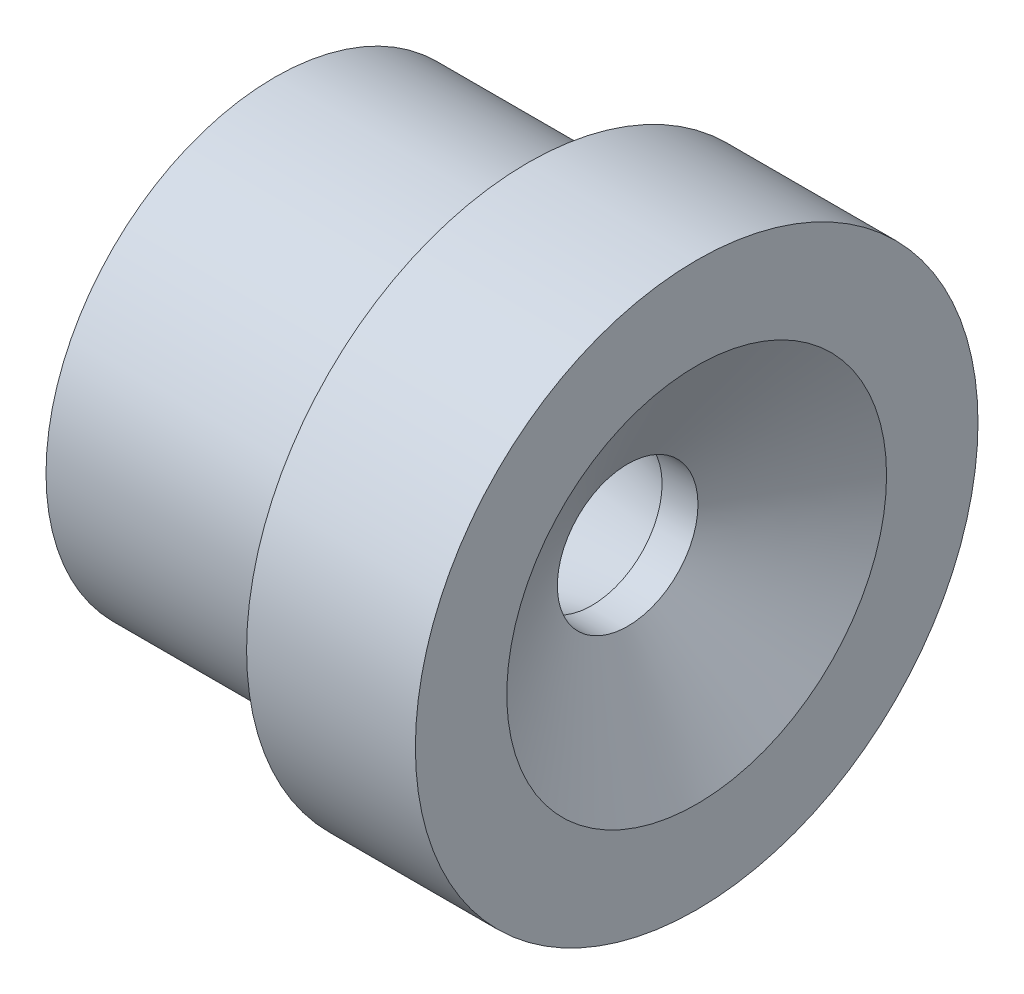
ISO-10303-21;
HEADER;
FILE_DESCRIPTION(('STEP AP214'),'2;1');
FILE_NAME('part.step','',(''),(''),'','','');
FILE_SCHEMA(('AUTOMOTIVE_DESIGN { 1 0 10303 214 1 1 1 1 }'));
ENDSEC;
DATA;
#1=APPLICATION_CONTEXT('core data for automotive mechanical design processes');
#2=APPLICATION_PROTOCOL_DEFINITION('international standard','automotive_design',2000,#1);
#3=PRODUCT_CONTEXT('',#1,'mechanical');
#4=PRODUCT('Part','Part','',(#3));
#5=PRODUCT_RELATED_PRODUCT_CATEGORY('part','',(#4));
#6=PRODUCT_DEFINITION_FORMATION('','',#4);
#7=PRODUCT_DEFINITION_CONTEXT('part definition',#1,'design');
#8=PRODUCT_DEFINITION('design','',#6,#7);
#9=PRODUCT_DEFINITION_SHAPE('','',#8);
#10=(LENGTH_UNIT() NAMED_UNIT(*) SI_UNIT(.MILLI.,.METRE.));
#11=(NAMED_UNIT(*) PLANE_ANGLE_UNIT() SI_UNIT($,.RADIAN.));
#12=(NAMED_UNIT(*) SI_UNIT($,.STERADIAN.) SOLID_ANGLE_UNIT());
#13=UNCERTAINTY_MEASURE_WITH_UNIT(LENGTH_MEASURE(1.E-05),#10,'distance_accuracy_value','');
#14=(GEOMETRIC_REPRESENTATION_CONTEXT(3) GLOBAL_UNCERTAINTY_ASSIGNED_CONTEXT((#13)) GLOBAL_UNIT_ASSIGNED_CONTEXT((#10,
#11,#12)) REPRESENTATION_CONTEXT('',''));
#15=CARTESIAN_POINT('',(0.,0.,0.));
#16=DIRECTION('',(0.,0.,1.));
#17=DIRECTION('',(1.,0.,0.));
#18=AXIS2_PLACEMENT_3D('',#15,#16,#17);
#19=CARTESIAN_POINT('',(5.11872970120267,0.,-12.7));
#20=DIRECTION('',(1.,0.,0.));
#21=DIRECTION('',(0.,0.,-1.));
#22=AXIS2_PLACEMENT_3D('',#19,#20,#21);
#23=CYLINDRICAL_SURFACE('',#22,12.7);
#24=CARTESIAN_POINT('',(0.,0.,-12.7));
#25=DIRECTION('',(1.,0.,0.));
#26=DIRECTION('',(0.,0.,-1.));
#27=AXIS2_PLACEMENT_3D('',#24,#25,#26);
#28=CIRCLE('',#27,12.7);
#29=CARTESIAN_POINT('',(0.,0.,-25.4));
#30=VERTEX_POINT('',#29);
#31=EDGE_CURVE('E10',#30,#30,#28,.T.);
#32=ORIENTED_EDGE('',*,*,#31,.F.);
#33=EDGE_LOOP('',(#32));
#34=FACE_BOUND('',#33,.T.);
#35=CARTESIAN_POINT('',(-7.62,0.,-12.7));
#36=DIRECTION('',(1.,0.,0.));
#37=DIRECTION('',(0.,0.,-1.));
#38=AXIS2_PLACEMENT_3D('',#35,#36,#37);
#39=CIRCLE('',#38,12.7);
#40=CARTESIAN_POINT('',(-7.62000000000001,0.,-25.4));
#41=VERTEX_POINT('',#40);
#42=EDGE_CURVE('E68',#41,#41,#39,.T.);
#43=ORIENTED_EDGE('',*,*,#42,.T.);
#44=EDGE_LOOP('',(#43));
#45=FACE_BOUND('',#44,.T.);
#46=ADVANCED_FACE('F36',(#34,#45),#23,.T.);
#47=CARTESIAN_POINT('',(0.,0.,0.));
#48=DIRECTION('',(-1.,0.,0.));
#49=DIRECTION('',(0.,0.,1.));
#50=AXIS2_PLACEMENT_3D('',#47,#48,#49);
#51=PLANE('',#50);
#52=CARTESIAN_POINT('',(0.,0.,-12.7));
#53=DIRECTION('',(1.,0.,0.));
#54=DIRECTION('',(0.,0.,-1.));
#55=AXIS2_PLACEMENT_3D('',#52,#53,#54);
#56=CIRCLE('',#55,8.5725);
#57=CARTESIAN_POINT('',(0.,0.,-21.2725));
#58=VERTEX_POINT('',#57);
#59=EDGE_CURVE('E42',#58,#58,#56,.T.);
#60=ORIENTED_EDGE('',*,*,#59,.F.);
#61=EDGE_LOOP('',(#60));
#62=FACE_BOUND('',#61,.T.);
#63=ORIENTED_EDGE('',*,*,#31,.T.);
#64=EDGE_LOOP('',(#63));
#65=FACE_BOUND('',#64,.T.);
#66=ADVANCED_FACE('F103',(#62,#65),#51,.F.);
#67=CARTESIAN_POINT('',(0.,0.,-12.7));
#68=DIRECTION('',(1.,0.,0.));
#69=DIRECTION('',(0.,0.,-1.));
#70=AXIS2_PLACEMENT_3D('',#67,#68,#69);
#71=CONICAL_SURFACE('',#70,8.5725,1.0471975511966);
#72=CARTESIAN_POINT('',(-3.11624807795099,0.,-12.7));
#73=DIRECTION('',(1.,0.,0.));
#74=DIRECTION('',(0.,0.,-1.));
#75=AXIS2_PLACEMENT_3D('',#72,#73,#74);
#76=CIRCLE('',#75,3.175);
#77=CARTESIAN_POINT('',(-3.11624807795099,0.,-15.875));
#78=VERTEX_POINT('',#77);
#79=EDGE_CURVE('E48',#78,#78,#76,.T.);
#80=ORIENTED_EDGE('',*,*,#79,.F.);
#81=EDGE_LOOP('',(#80));
#82=FACE_BOUND('',#81,.T.);
#83=ORIENTED_EDGE('',*,*,#59,.T.);
#84=EDGE_LOOP('',(#83));
#85=FACE_BOUND('',#84,.T.);
#86=ADVANCED_FACE('F98',(#82,#85),#71,.F.);
#87=CARTESIAN_POINT('',(5.11872970120267,0.,-12.7));
#88=DIRECTION('',(1.,0.,0.));
#89=DIRECTION('',(0.,0.,-1.));
#90=AXIS2_PLACEMENT_3D('',#87,#88,#89);
#91=CYLINDRICAL_SURFACE('',#90,3.175);
#92=CARTESIAN_POINT('',(-4.73676807795099,0.,-12.7));
#93=DIRECTION('',(1.,0.,0.));
#94=DIRECTION('',(0.,0.,-1.));
#95=AXIS2_PLACEMENT_3D('',#92,#93,#94);
#96=CIRCLE('',#95,3.175);
#97=CARTESIAN_POINT('',(-4.73676807795099,0.,-15.875));
#98=VERTEX_POINT('',#97);
#99=EDGE_CURVE('E55',#98,#98,#96,.T.);
#100=ORIENTED_EDGE('',*,*,#99,.F.);
#101=EDGE_LOOP('',(#100));
#102=FACE_BOUND('',#101,.T.);
#103=ORIENTED_EDGE('',*,*,#79,.T.);
#104=EDGE_LOOP('',(#103));
#105=FACE_BOUND('',#104,.T.);
#106=ADVANCED_FACE('F95',(#102,#105),#91,.F.);
#107=CARTESIAN_POINT('',(-4.73676807795099,0.,-12.7));
#108=DIRECTION('',(-1.,0.,0.));
#109=DIRECTION('',(0.,0.,1.));
#110=AXIS2_PLACEMENT_3D('',#107,#108,#109);
#111=CONICAL_SURFACE('',#110,3.175,0.26179938779915);
#112=CARTESIAN_POINT('',(-19.05,0.,-12.7));
#113=DIRECTION('',(1.,0.,0.));
#114=DIRECTION('',(0.,0.,-1.));
#115=AXIS2_PLACEMENT_3D('',#112,#113,#114);
#116=CIRCLE('',#115,7.01021893459241);
#117=CARTESIAN_POINT('',(-19.05,0.,-19.7102189345924));
#118=VERTEX_POINT('',#117);
#119=EDGE_CURVE('E60',#118,#118,#116,.T.);
#120=ORIENTED_EDGE('',*,*,#119,.F.);
#121=EDGE_LOOP('',(#120));
#122=FACE_BOUND('',#121,.T.);
#123=ORIENTED_EDGE('',*,*,#99,.T.);
#124=EDGE_LOOP('',(#123));
#125=FACE_BOUND('',#124,.T.);
#126=ADVANCED_FACE('F88',(#122,#125),#111,.F.);
#127=CARTESIAN_POINT('',(-19.05,0.,-5.68978106540759));
#128=DIRECTION('',(1.,0.,0.));
#129=DIRECTION('',(0.,0.,-1.));
#130=AXIS2_PLACEMENT_3D('',#127,#128,#129);
#131=PLANE('',#130);
#132=CARTESIAN_POINT('',(-19.05,0.,-12.7));
#133=DIRECTION('',(1.,0.,0.));
#134=DIRECTION('',(0.,0.,-1.));
#135=AXIS2_PLACEMENT_3D('',#132,#133,#134);
#136=CIRCLE('',#135,10.3251);
#137=CARTESIAN_POINT('',(-19.05,0.,-23.0251));
#138=VERTEX_POINT('',#137);
#139=EDGE_CURVE('E58',#138,#138,#136,.T.);
#140=ORIENTED_EDGE('',*,*,#139,.F.);
#141=EDGE_LOOP('',(#140));
#142=FACE_BOUND('',#141,.T.);
#143=ORIENTED_EDGE('',*,*,#119,.T.);
#144=EDGE_LOOP('',(#143));
#145=FACE_BOUND('',#144,.T.);
#146=ADVANCED_FACE('F77',(#142,#145),#131,.F.);
#147=CARTESIAN_POINT('',(5.11872970120267,0.,-12.7));
#148=DIRECTION('',(1.,0.,0.));
#149=DIRECTION('',(0.,0.,-1.));
#150=AXIS2_PLACEMENT_3D('',#147,#148,#149);
#151=CYLINDRICAL_SURFACE('',#150,10.3251);
#152=CARTESIAN_POINT('',(-7.62,0.,-12.7));
#153=DIRECTION('',(1.,0.,0.));
#154=DIRECTION('',(0.,0.,-1.));
#155=AXIS2_PLACEMENT_3D('',#152,#153,#154);
#156=CIRCLE('',#155,10.3251);
#157=CARTESIAN_POINT('',(-7.62,0.,-23.0251));
#158=VERTEX_POINT('',#157);
#159=EDGE_CURVE('E65',#158,#158,#156,.T.);
#160=ORIENTED_EDGE('',*,*,#159,.F.);
#161=EDGE_LOOP('',(#160));
#162=FACE_BOUND('',#161,.T.);
#163=ORIENTED_EDGE('',*,*,#139,.T.);
#164=EDGE_LOOP('',(#163));
#165=FACE_BOUND('',#164,.T.);
#166=ADVANCED_FACE('F74',(#162,#165),#151,.T.);
#167=CARTESIAN_POINT('',(-7.62,0.,-2.3749));
#168=DIRECTION('',(1.,0.,0.));
#169=DIRECTION('',(0.,0.,-1.));
#170=AXIS2_PLACEMENT_3D('',#167,#168,#169);
#171=PLANE('',#170);
#172=ORIENTED_EDGE('',*,*,#42,.F.);
#173=EDGE_LOOP('',(#172));
#174=FACE_BOUND('',#173,.T.);
#175=ORIENTED_EDGE('',*,*,#159,.T.);
#176=EDGE_LOOP('',(#175));
#177=FACE_BOUND('',#176,.T.);
#178=ADVANCED_FACE('F72',(#174,#177),#171,.F.);
#179=CLOSED_SHELL('',(#46,#66,#86,#106,#126,#146,#166,#178));
#180=MANIFOLD_SOLID_BREP('B2',#179);
#181=ADVANCED_BREP_SHAPE_REPRESENTATION('',(#18,#180),#14);
#182=SHAPE_DEFINITION_REPRESENTATION(#9,#181);
ENDSEC;
END-ISO-10303-21;
